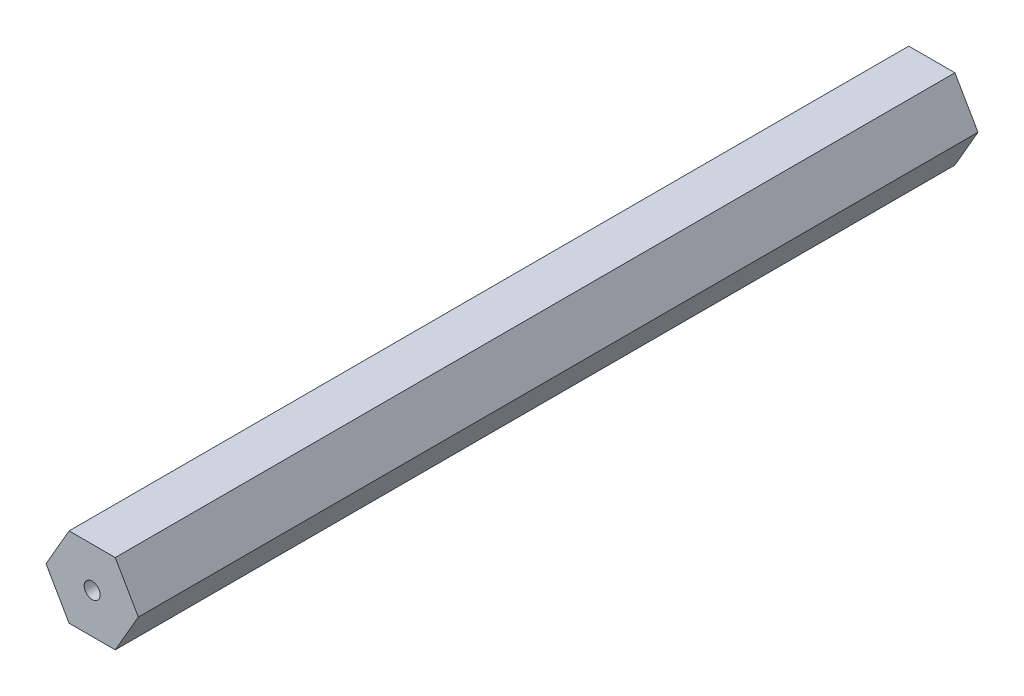
ISO-10303-21;
HEADER;
FILE_DESCRIPTION(('STEP AP214'),'2;1');
FILE_NAME('part.step','',(''),(''),'','','');
FILE_SCHEMA(('AUTOMOTIVE_DESIGN { 1 0 10303 214 1 1 1 1 }'));
ENDSEC;
DATA;
#1=APPLICATION_CONTEXT('core data for automotive mechanical design processes');
#2=APPLICATION_PROTOCOL_DEFINITION('international standard','automotive_design',2000,#1);
#3=PRODUCT_CONTEXT('',#1,'mechanical');
#4=PRODUCT('Part','Part','',(#3));
#5=PRODUCT_RELATED_PRODUCT_CATEGORY('part','',(#4));
#6=PRODUCT_DEFINITION_FORMATION('','',#4);
#7=PRODUCT_DEFINITION_CONTEXT('part definition',#1,'design');
#8=PRODUCT_DEFINITION('design','',#6,#7);
#9=PRODUCT_DEFINITION_SHAPE('','',#8);
#10=(LENGTH_UNIT() NAMED_UNIT(*) SI_UNIT(.MILLI.,.METRE.));
#11=(NAMED_UNIT(*) PLANE_ANGLE_UNIT() SI_UNIT($,.RADIAN.));
#12=(NAMED_UNIT(*) SI_UNIT($,.STERADIAN.) SOLID_ANGLE_UNIT());
#13=UNCERTAINTY_MEASURE_WITH_UNIT(LENGTH_MEASURE(1.E-05),#10,'distance_accuracy_value','');
#14=(GEOMETRIC_REPRESENTATION_CONTEXT(3) GLOBAL_UNCERTAINTY_ASSIGNED_CONTEXT((#13)) GLOBAL_UNIT_ASSIGNED_CONTEXT((#10,
#11,#12)) REPRESENTATION_CONTEXT('',''));
#15=CARTESIAN_POINT('',(0.,0.,0.));
#16=DIRECTION('',(0.,0.,1.));
#17=DIRECTION('',(1.,0.,0.));
#18=AXIS2_PLACEMENT_3D('',#15,#16,#17);
#19=CARTESIAN_POINT('',(0.,0.,133.35));
#20=DIRECTION('',(0.,0.,1.));
#21=DIRECTION('',(1.,0.,0.));
#22=AXIS2_PLACEMENT_3D('',#19,#20,#21);
#23=PLANE('',#22);
#24=DIRECTION('',(0.499999999999995,0.866025403784442,0.));
#25=VECTOR('',#24,1.);
#26=CARTESIAN_POINT('',(3.66617420935418,-6.34999999999993,133.35));
#27=LINE('',#26,#25);
#28=CARTESIAN_POINT('',(3.66617420935418,-6.34999999999993,133.35));
#29=VERTEX_POINT('',#28);
#30=CARTESIAN_POINT('',(7.33234841870822,0.,133.35));
#31=VERTEX_POINT('',#30);
#32=EDGE_CURVE('E146',#29,#31,#27,.T.);
#33=ORIENTED_EDGE('',*,*,#32,.T.);
#34=DIRECTION('',(-0.500000000000001,0.866025403784438,0.));
#35=VECTOR('',#34,1.);
#36=CARTESIAN_POINT('',(7.33234841870822,0.,133.35));
#37=LINE('',#36,#35);
#38=CARTESIAN_POINT('',(3.66617420935409,6.34999999999998,133.35));
#39=VERTEX_POINT('',#38);
#40=EDGE_CURVE('E94',#31,#39,#37,.T.);
#41=ORIENTED_EDGE('',*,*,#40,.T.);
#42=DIRECTION('',(-1.,0.,0.));
#43=VECTOR('',#42,1.);
#44=CARTESIAN_POINT('',(3.66617420935409,6.34999999999998,133.35));
#45=LINE('',#44,#43);
#46=CARTESIAN_POINT('',(-3.66617420935414,6.34999999999996,133.35));
#47=VERTEX_POINT('',#46);
#48=EDGE_CURVE('E107',#39,#47,#45,.T.);
#49=ORIENTED_EDGE('',*,*,#48,.T.);
#50=DIRECTION('',(-0.499999999999995,-0.866025403784441,0.));
#51=VECTOR('',#50,1.);
#52=CARTESIAN_POINT('',(-3.66617420935414,6.34999999999996,133.35));
#53=LINE('',#52,#51);
#54=CARTESIAN_POINT('',(-7.33234841870822,0.,133.35));
#55=VERTEX_POINT('',#54);
#56=EDGE_CURVE('E101',#47,#55,#53,.T.);
#57=ORIENTED_EDGE('',*,*,#56,.T.);
#58=DIRECTION('',(0.500000000000007,-0.866025403784434,0.));
#59=VECTOR('',#58,1.);
#60=CARTESIAN_POINT('',(-7.33234841870822,0.,133.35));
#61=LINE('',#60,#59);
#62=CARTESIAN_POINT('',(-3.66617420935405,-6.35000000000001,133.35));
#63=VERTEX_POINT('',#62);
#64=EDGE_CURVE('E105',#55,#63,#61,.T.);
#65=ORIENTED_EDGE('',*,*,#64,.T.);
#66=DIRECTION('',(1.,0.,0.));
#67=VECTOR('',#66,1.);
#68=CARTESIAN_POINT('',(-3.66617420935405,-6.35000000000001,133.35));
#69=LINE('',#68,#67);
#70=EDGE_CURVE('E57',#63,#29,#69,.T.);
#71=ORIENTED_EDGE('',*,*,#70,.T.);
#72=EDGE_LOOP('',(#33,#41,#49,#57,#65,#71));
#73=FACE_BOUND('',#72,.T.);
#74=CARTESIAN_POINT('',(0.,0.,133.35));
#75=DIRECTION('',(0.,0.,1.));
#76=DIRECTION('',(1.,0.,0.));
#77=AXIS2_PLACEMENT_3D('',#74,#75,#76);
#78=CIRCLE('',#77,1.27);
#79=CARTESIAN_POINT('',(1.27,0.,133.35));
#80=VERTEX_POINT('',#79);
#81=EDGE_CURVE('E134',#80,#80,#78,.T.);
#82=ORIENTED_EDGE('',*,*,#81,.F.);
#83=EDGE_LOOP('',(#82));
#84=FACE_BOUND('',#83,.T.);
#85=ADVANCED_FACE('F39',(#73,#84),#23,.T.);
#86=CARTESIAN_POINT('',(0.,0.,0.));
#87=DIRECTION('',(0.,0.,1.));
#88=DIRECTION('',(1.,0.,0.));
#89=AXIS2_PLACEMENT_3D('',#86,#87,#88);
#90=PLANE('',#89);
#91=DIRECTION('',(0.499999999999995,0.866025403784442,0.));
#92=VECTOR('',#91,1.);
#93=CARTESIAN_POINT('',(3.66617420935418,-6.34999999999993,0.));
#94=LINE('',#93,#92);
#95=CARTESIAN_POINT('',(3.66617420935418,-6.34999999999993,0.));
#96=VERTEX_POINT('',#95);
#97=CARTESIAN_POINT('',(7.33234841870822,0.,0.));
#98=VERTEX_POINT('',#97);
#99=EDGE_CURVE('E129',#96,#98,#94,.T.);
#100=ORIENTED_EDGE('',*,*,#99,.F.);
#101=DIRECTION('',(1.,0.,0.));
#102=VECTOR('',#101,1.);
#103=CARTESIAN_POINT('',(-3.66617420935405,-6.35000000000001,0.));
#104=LINE('',#103,#102);
#105=CARTESIAN_POINT('',(-3.66617420935405,-6.35000000000001,0.));
#106=VERTEX_POINT('',#105);
#107=EDGE_CURVE('E86',#106,#96,#104,.T.);
#108=ORIENTED_EDGE('',*,*,#107,.F.);
#109=DIRECTION('',(0.500000000000007,-0.866025403784434,0.));
#110=VECTOR('',#109,1.);
#111=CARTESIAN_POINT('',(-7.33234841870822,0.,0.));
#112=LINE('',#111,#110);
#113=CARTESIAN_POINT('',(-7.33234841870822,0.,0.));
#114=VERTEX_POINT('',#113);
#115=EDGE_CURVE('E80',#114,#106,#112,.T.);
#116=ORIENTED_EDGE('',*,*,#115,.F.);
#117=DIRECTION('',(-0.499999999999995,-0.866025403784441,0.));
#118=VECTOR('',#117,1.);
#119=CARTESIAN_POINT('',(-3.66617420935414,6.34999999999996,0.));
#120=LINE('',#119,#118);
#121=CARTESIAN_POINT('',(-3.66617420935414,6.34999999999996,0.));
#122=VERTEX_POINT('',#121);
#123=EDGE_CURVE('E116',#122,#114,#120,.T.);
#124=ORIENTED_EDGE('',*,*,#123,.F.);
#125=DIRECTION('',(-1.,0.,0.));
#126=VECTOR('',#125,1.);
#127=CARTESIAN_POINT('',(3.66617420935409,6.34999999999998,0.));
#128=LINE('',#127,#126);
#129=CARTESIAN_POINT('',(3.66617420935409,6.34999999999998,0.));
#130=VERTEX_POINT('',#129);
#131=EDGE_CURVE('E137',#130,#122,#128,.T.);
#132=ORIENTED_EDGE('',*,*,#131,.F.);
#133=DIRECTION('',(-0.500000000000001,0.866025403784438,0.));
#134=VECTOR('',#133,1.);
#135=CARTESIAN_POINT('',(7.33234841870822,0.,0.));
#136=LINE('',#135,#134);
#137=EDGE_CURVE('E133',#98,#130,#136,.T.);
#138=ORIENTED_EDGE('',*,*,#137,.F.);
#139=EDGE_LOOP('',(#100,#108,#116,#124,#132,#138));
#140=FACE_BOUND('',#139,.T.);
#141=CARTESIAN_POINT('',(0.,0.,0.));
#142=DIRECTION('',(0.,0.,1.));
#143=DIRECTION('',(1.,0.,0.));
#144=AXIS2_PLACEMENT_3D('',#141,#142,#143);
#145=CIRCLE('',#144,1.27);
#146=CARTESIAN_POINT('',(1.27,0.,0.));
#147=VERTEX_POINT('',#146);
#148=EDGE_CURVE('E243',#147,#147,#145,.T.);
#149=ORIENTED_EDGE('',*,*,#148,.T.);
#150=EDGE_LOOP('',(#149));
#151=FACE_BOUND('',#150,.T.);
#152=ADVANCED_FACE('F159',(#140,#151),#90,.F.);
#153=CARTESIAN_POINT('',(3.66617420935418,-6.34999999999993,133.35));
#154=DIRECTION('',(-0.866025403784442,0.499999999999995,0.));
#155=DIRECTION('',(-0.499999999999995,-0.866025403784442,0.));
#156=AXIS2_PLACEMENT_3D('',#153,#154,#155);
#157=PLANE('',#156);
#158=ORIENTED_EDGE('',*,*,#99,.T.);
#159=DIRECTION('',(0.,0.,-1.));
#160=VECTOR('',#159,1.);
#161=CARTESIAN_POINT('',(7.33234841870822,0.,133.35));
#162=LINE('',#161,#160);
#163=EDGE_CURVE('E11',#31,#98,#162,.T.);
#164=ORIENTED_EDGE('',*,*,#163,.F.);
#165=ORIENTED_EDGE('',*,*,#32,.F.);
#166=DIRECTION('',(0.,0.,-1.));
#167=VECTOR('',#166,1.);
#168=CARTESIAN_POINT('',(3.66617420935418,-6.34999999999993,133.35));
#169=LINE('',#168,#167);
#170=EDGE_CURVE('E125',#29,#96,#169,.T.);
#171=ORIENTED_EDGE('',*,*,#170,.T.);
#172=EDGE_LOOP('',(#158,#164,#165,#171));
#173=FACE_BOUND('',#172,.T.);
#174=ADVANCED_FACE('F41',(#173),#157,.F.);
#175=CARTESIAN_POINT('',(7.33234841870822,0.,133.35));
#176=DIRECTION('',(-0.866025403784438,-0.500000000000001,0.));
#177=DIRECTION('',(0.500000000000001,-0.866025403784438,0.));
#178=AXIS2_PLACEMENT_3D('',#175,#176,#177);
#179=PLANE('',#178);
#180=ORIENTED_EDGE('',*,*,#137,.T.);
#181=DIRECTION('',(0.,0.,-1.));
#182=VECTOR('',#181,1.);
#183=CARTESIAN_POINT('',(3.66617420935409,6.34999999999998,133.35));
#184=LINE('',#183,#182);
#185=EDGE_CURVE('E49',#39,#130,#184,.T.);
#186=ORIENTED_EDGE('',*,*,#185,.F.);
#187=ORIENTED_EDGE('',*,*,#40,.F.);
#188=ORIENTED_EDGE('',*,*,#163,.T.);
#189=EDGE_LOOP('',(#180,#186,#187,#188));
#190=FACE_BOUND('',#189,.T.);
#191=ADVANCED_FACE('F184',(#190),#179,.F.);
#192=CARTESIAN_POINT('',(3.66617420935409,6.34999999999998,133.35));
#193=DIRECTION('',(0.,-1.,0.));
#194=DIRECTION('',(1.,0.,0.));
#195=AXIS2_PLACEMENT_3D('',#192,#193,#194);
#196=PLANE('',#195);
#197=ORIENTED_EDGE('',*,*,#131,.T.);
#198=DIRECTION('',(0.,0.,-1.));
#199=VECTOR('',#198,1.);
#200=CARTESIAN_POINT('',(-3.66617420935414,6.34999999999996,133.35));
#201=LINE('',#200,#199);
#202=EDGE_CURVE('E118',#47,#122,#201,.T.);
#203=ORIENTED_EDGE('',*,*,#202,.F.);
#204=ORIENTED_EDGE('',*,*,#48,.F.);
#205=ORIENTED_EDGE('',*,*,#185,.T.);
#206=EDGE_LOOP('',(#197,#203,#204,#205));
#207=FACE_BOUND('',#206,.T.);
#208=ADVANCED_FACE('F156',(#207),#196,.F.);
#209=CARTESIAN_POINT('',(-3.66617420935414,6.34999999999996,133.35));
#210=DIRECTION('',(0.866025403784441,-0.499999999999995,0.));
#211=DIRECTION('',(0.499999999999995,0.866025403784441,0.));
#212=AXIS2_PLACEMENT_3D('',#209,#210,#211);
#213=PLANE('',#212);
#214=ORIENTED_EDGE('',*,*,#123,.T.);
#215=DIRECTION('',(0.,0.,-1.));
#216=VECTOR('',#215,1.);
#217=CARTESIAN_POINT('',(-7.33234841870822,0.,133.35));
#218=LINE('',#217,#216);
#219=EDGE_CURVE('E113',#55,#114,#218,.T.);
#220=ORIENTED_EDGE('',*,*,#219,.F.);
#221=ORIENTED_EDGE('',*,*,#56,.F.);
#222=ORIENTED_EDGE('',*,*,#202,.T.);
#223=EDGE_LOOP('',(#214,#220,#221,#222));
#224=FACE_BOUND('',#223,.T.);
#225=ADVANCED_FACE('F114',(#224),#213,.F.);
#226=CARTESIAN_POINT('',(-7.33234841870822,0.,133.35));
#227=DIRECTION('',(0.866025403784434,0.500000000000007,0.));
#228=DIRECTION('',(-0.500000000000007,0.866025403784435,0.));
#229=AXIS2_PLACEMENT_3D('',#226,#227,#228);
#230=PLANE('',#229);
#231=ORIENTED_EDGE('',*,*,#115,.T.);
#232=DIRECTION('',(0.,0.,-1.));
#233=VECTOR('',#232,1.);
#234=CARTESIAN_POINT('',(-3.66617420935405,-6.35000000000001,133.35));
#235=LINE('',#234,#233);
#236=EDGE_CURVE('E119',#63,#106,#235,.T.);
#237=ORIENTED_EDGE('',*,*,#236,.F.);
#238=ORIENTED_EDGE('',*,*,#64,.F.);
#239=ORIENTED_EDGE('',*,*,#219,.T.);
#240=EDGE_LOOP('',(#231,#237,#238,#239));
#241=FACE_BOUND('',#240,.T.);
#242=ADVANCED_FACE('F121',(#241),#230,.F.);
#243=CARTESIAN_POINT('',(-3.66617420935405,-6.35000000000001,133.35));
#244=DIRECTION('',(0.,1.,0.));
#245=DIRECTION('',(-1.,0.,0.));
#246=AXIS2_PLACEMENT_3D('',#243,#244,#245);
#247=PLANE('',#246);
#248=ORIENTED_EDGE('',*,*,#107,.T.);
#249=ORIENTED_EDGE('',*,*,#170,.F.);
#250=ORIENTED_EDGE('',*,*,#70,.F.);
#251=ORIENTED_EDGE('',*,*,#236,.T.);
#252=EDGE_LOOP('',(#248,#249,#250,#251));
#253=FACE_BOUND('',#252,.T.);
#254=ADVANCED_FACE('F164',(#253),#247,.F.);
#255=CARTESIAN_POINT('',(0.,0.,133.35));
#256=DIRECTION('',(0.,0.,-1.));
#257=DIRECTION('',(-1.,0.,0.));
#258=AXIS2_PLACEMENT_3D('',#255,#256,#257);
#259=CYLINDRICAL_SURFACE('',#258,1.27);
#260=ORIENTED_EDGE('',*,*,#81,.T.);
#261=EDGE_LOOP('',(#260));
#262=FACE_BOUND('',#261,.T.);
#263=ORIENTED_EDGE('',*,*,#148,.F.);
#264=EDGE_LOOP('',(#263));
#265=FACE_BOUND('',#264,.T.);
#266=ADVANCED_FACE('F166',(#262,#265),#259,.F.);
#267=CLOSED_SHELL('',(#85,#152,#174,#191,#208,#225,#242,#254,#266));
#268=MANIFOLD_SOLID_BREP('B2',#267);
#269=ADVANCED_BREP_SHAPE_REPRESENTATION('',(#18,#268),#14);
#270=SHAPE_DEFINITION_REPRESENTATION(#9,#269);
ENDSEC;
END-ISO-10303-21;
